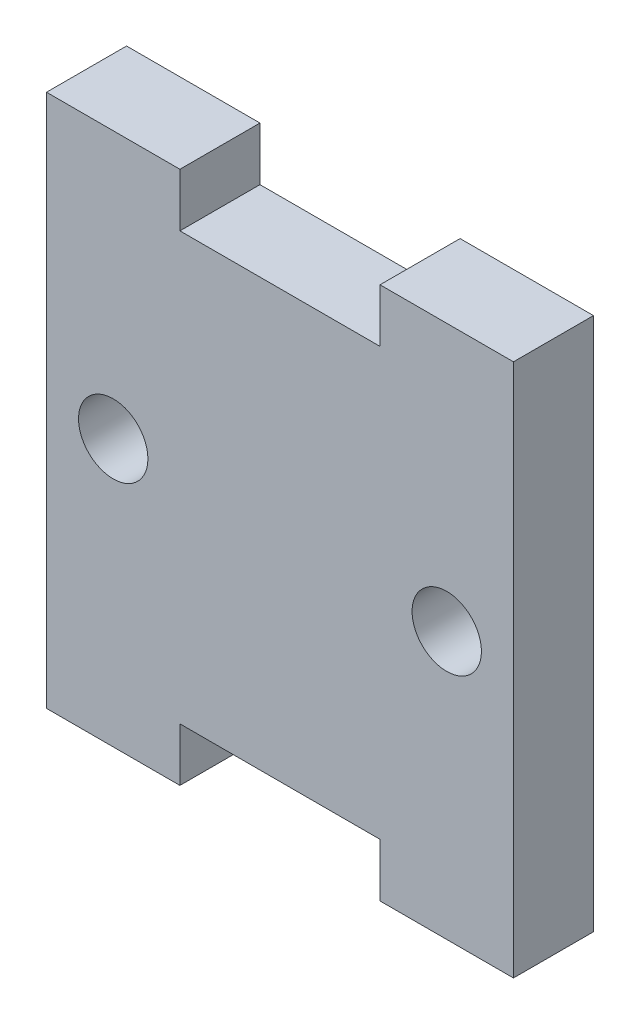
ISO-10303-21;
HEADER;
FILE_DESCRIPTION(('STEP AP214'),'2;1');
FILE_NAME('part.step','',(''),(''),'','','');
FILE_SCHEMA(('AUTOMOTIVE_DESIGN { 1 0 10303 214 1 1 1 1 }'));
ENDSEC;
DATA;
#1=APPLICATION_CONTEXT('core data for automotive mechanical design processes');
#2=APPLICATION_PROTOCOL_DEFINITION('international standard','automotive_design',2000,#1);
#3=PRODUCT_CONTEXT('',#1,'mechanical');
#4=PRODUCT('Part','Part','',(#3));
#5=PRODUCT_RELATED_PRODUCT_CATEGORY('part','',(#4));
#6=PRODUCT_DEFINITION_FORMATION('','',#4);
#7=PRODUCT_DEFINITION_CONTEXT('part definition',#1,'design');
#8=PRODUCT_DEFINITION('design','',#6,#7);
#9=PRODUCT_DEFINITION_SHAPE('','',#8);
#10=(LENGTH_UNIT() NAMED_UNIT(*) SI_UNIT(.MILLI.,.METRE.));
#11=(NAMED_UNIT(*) PLANE_ANGLE_UNIT() SI_UNIT($,.RADIAN.));
#12=(NAMED_UNIT(*) SI_UNIT($,.STERADIAN.) SOLID_ANGLE_UNIT());
#13=UNCERTAINTY_MEASURE_WITH_UNIT(LENGTH_MEASURE(1.E-05),#10,'distance_accuracy_value','');
#14=(GEOMETRIC_REPRESENTATION_CONTEXT(3) GLOBAL_UNCERTAINTY_ASSIGNED_CONTEXT((#13)) GLOBAL_UNIT_ASSIGNED_CONTEXT((#10,
#11,#12)) REPRESENTATION_CONTEXT('',''));
#15=CARTESIAN_POINT('',(0.,0.,0.));
#16=DIRECTION('',(0.,0.,1.));
#17=DIRECTION('',(1.,0.,0.));
#18=AXIS2_PLACEMENT_3D('',#15,#16,#17);
#19=CARTESIAN_POINT('',(-17.5,0.,6.));
#20=DIRECTION('',(-1.,0.,0.));
#21=DIRECTION('',(0.,0.,1.));
#22=AXIS2_PLACEMENT_3D('',#19,#20,#21);
#23=PLANE('',#22);
#24=DIRECTION('',(0.,1.,0.));
#25=VECTOR('',#24,1.);
#26=CARTESIAN_POINT('',(-17.5,0.,0.));
#27=LINE('',#26,#25);
#28=CARTESIAN_POINT('',(-17.5,-20.,0.));
#29=VERTEX_POINT('',#28);
#30=CARTESIAN_POINT('',(-17.5,20.,0.));
#31=VERTEX_POINT('',#30);
#32=EDGE_CURVE('E161',#29,#31,#27,.T.);
#33=ORIENTED_EDGE('',*,*,#32,.F.);
#34=DIRECTION('',(0.,0.,-1.));
#35=VECTOR('',#34,1.);
#36=CARTESIAN_POINT('',(-17.5,-20.,6.));
#37=LINE('',#36,#35);
#38=CARTESIAN_POINT('',(-17.5,-20.,6.));
#39=VERTEX_POINT('',#38);
#40=EDGE_CURVE('E11',#39,#29,#37,.T.);
#41=ORIENTED_EDGE('',*,*,#40,.F.);
#42=DIRECTION('',(0.,1.,0.));
#43=VECTOR('',#42,1.);
#44=CARTESIAN_POINT('',(-17.5,0.,6.));
#45=LINE('',#44,#43);
#46=CARTESIAN_POINT('',(-17.5,20.,6.));
#47=VERTEX_POINT('',#46);
#48=EDGE_CURVE('E197',#39,#47,#45,.T.);
#49=ORIENTED_EDGE('',*,*,#48,.T.);
#50=DIRECTION('',(0.,0.,-1.));
#51=VECTOR('',#50,1.);
#52=CARTESIAN_POINT('',(-17.5,20.,6.));
#53=LINE('',#52,#51);
#54=EDGE_CURVE('E99',#47,#31,#53,.T.);
#55=ORIENTED_EDGE('',*,*,#54,.T.);
#56=EDGE_LOOP('',(#33,#41,#49,#55));
#57=FACE_BOUND('',#56,.T.);
#58=ADVANCED_FACE('F37',(#57),#23,.T.);
#59=CARTESIAN_POINT('',(0.,-20.,6.));
#60=DIRECTION('',(0.,-1.,0.));
#61=DIRECTION('',(0.,0.,-1.));
#62=AXIS2_PLACEMENT_3D('',#59,#60,#61);
#63=PLANE('',#62);
#64=DIRECTION('',(-1.,0.,0.));
#65=VECTOR('',#64,1.);
#66=CARTESIAN_POINT('',(0.,-20.,0.));
#67=LINE('',#66,#65);
#68=CARTESIAN_POINT('',(-7.5,-20.,0.));
#69=VERTEX_POINT('',#68);
#70=EDGE_CURVE('E164',#69,#29,#67,.T.);
#71=ORIENTED_EDGE('',*,*,#70,.F.);
#72=DIRECTION('',(0.,0.,-1.));
#73=VECTOR('',#72,1.);
#74=CARTESIAN_POINT('',(-7.5,-20.,6.));
#75=LINE('',#74,#73);
#76=CARTESIAN_POINT('',(-7.5,-20.,6.));
#77=VERTEX_POINT('',#76);
#78=EDGE_CURVE('E45',#77,#69,#75,.T.);
#79=ORIENTED_EDGE('',*,*,#78,.F.);
#80=DIRECTION('',(-1.,0.,0.));
#81=VECTOR('',#80,1.);
#82=CARTESIAN_POINT('',(0.,-20.,6.));
#83=LINE('',#82,#81);
#84=EDGE_CURVE('E229',#77,#39,#83,.T.);
#85=ORIENTED_EDGE('',*,*,#84,.T.);
#86=ORIENTED_EDGE('',*,*,#40,.T.);
#87=EDGE_LOOP('',(#71,#79,#85,#86));
#88=FACE_BOUND('',#87,.T.);
#89=ADVANCED_FACE('F228',(#88),#63,.T.);
#90=CARTESIAN_POINT('',(-7.5,0.,6.));
#91=DIRECTION('',(-1.,0.,0.));
#92=DIRECTION('',(0.,0.,1.));
#93=AXIS2_PLACEMENT_3D('',#90,#91,#92);
#94=PLANE('',#93);
#95=DIRECTION('',(0.,1.,0.));
#96=VECTOR('',#95,1.);
#97=CARTESIAN_POINT('',(-7.5,0.,0.));
#98=LINE('',#97,#96);
#99=CARTESIAN_POINT('',(-7.5,-16.,0.));
#100=VERTEX_POINT('',#99);
#101=EDGE_CURVE('E167',#69,#100,#98,.T.);
#102=ORIENTED_EDGE('',*,*,#101,.T.);
#103=DIRECTION('',(0.,0.,-1.));
#104=VECTOR('',#103,1.);
#105=CARTESIAN_POINT('',(-7.5,-16.,6.));
#106=LINE('',#105,#104);
#107=CARTESIAN_POINT('',(-7.5,-16.,6.));
#108=VERTEX_POINT('',#107);
#109=EDGE_CURVE('E212',#108,#100,#106,.T.);
#110=ORIENTED_EDGE('',*,*,#109,.F.);
#111=DIRECTION('',(0.,1.,0.));
#112=VECTOR('',#111,1.);
#113=CARTESIAN_POINT('',(-7.5,0.,6.));
#114=LINE('',#113,#112);
#115=EDGE_CURVE('E219',#77,#108,#114,.T.);
#116=ORIENTED_EDGE('',*,*,#115,.F.);
#117=ORIENTED_EDGE('',*,*,#78,.T.);
#118=EDGE_LOOP('',(#102,#110,#116,#117));
#119=FACE_BOUND('',#118,.T.);
#120=ADVANCED_FACE('F217',(#119),#94,.F.);
#121=CARTESIAN_POINT('',(0.,-16.,6.));
#122=DIRECTION('',(0.,1.,0.));
#123=DIRECTION('',(0.,0.,1.));
#124=AXIS2_PLACEMENT_3D('',#121,#122,#123);
#125=PLANE('',#124);
#126=DIRECTION('',(1.,0.,0.));
#127=VECTOR('',#126,1.);
#128=CARTESIAN_POINT('',(0.,-16.,0.));
#129=LINE('',#128,#127);
#130=CARTESIAN_POINT('',(7.5,-16.,0.));
#131=VERTEX_POINT('',#130);
#132=EDGE_CURVE('E169',#100,#131,#129,.T.);
#133=ORIENTED_EDGE('',*,*,#132,.T.);
#134=DIRECTION('',(0.,0.,-1.));
#135=VECTOR('',#134,1.);
#136=CARTESIAN_POINT('',(7.5,-16.,6.));
#137=LINE('',#136,#135);
#138=CARTESIAN_POINT('',(7.5,-16.,6.));
#139=VERTEX_POINT('',#138);
#140=EDGE_CURVE('E210',#139,#131,#137,.T.);
#141=ORIENTED_EDGE('',*,*,#140,.F.);
#142=DIRECTION('',(1.,0.,0.));
#143=VECTOR('',#142,1.);
#144=CARTESIAN_POINT('',(0.,-16.,6.));
#145=LINE('',#144,#143);
#146=EDGE_CURVE('E235',#108,#139,#145,.T.);
#147=ORIENTED_EDGE('',*,*,#146,.F.);
#148=ORIENTED_EDGE('',*,*,#109,.T.);
#149=EDGE_LOOP('',(#133,#141,#147,#148));
#150=FACE_BOUND('',#149,.T.);
#151=ADVANCED_FACE('F276',(#150),#125,.F.);
#152=CARTESIAN_POINT('',(7.50000000000001,0.,6.));
#153=DIRECTION('',(-1.,0.,0.));
#154=DIRECTION('',(0.,-1.,0.));
#155=AXIS2_PLACEMENT_3D('',#152,#153,#154);
#156=PLANE('',#155);
#157=DIRECTION('',(0.,1.,0.));
#158=VECTOR('',#157,1.);
#159=CARTESIAN_POINT('',(7.50000000000001,0.,0.));
#160=LINE('',#159,#158);
#161=CARTESIAN_POINT('',(7.5,-20.,0.));
#162=VERTEX_POINT('',#161);
#163=EDGE_CURVE('E172',#162,#131,#160,.T.);
#164=ORIENTED_EDGE('',*,*,#163,.F.);
#165=DIRECTION('',(0.,0.,-1.));
#166=VECTOR('',#165,1.);
#167=CARTESIAN_POINT('',(7.5,-20.,6.));
#168=LINE('',#167,#166);
#169=CARTESIAN_POINT('',(7.5,-20.,6.));
#170=VERTEX_POINT('',#169);
#171=EDGE_CURVE('E208',#170,#162,#168,.T.);
#172=ORIENTED_EDGE('',*,*,#171,.F.);
#173=DIRECTION('',(0.,1.,0.));
#174=VECTOR('',#173,1.);
#175=CARTESIAN_POINT('',(7.50000000000001,0.,6.));
#176=LINE('',#175,#174);
#177=EDGE_CURVE('E237',#170,#139,#176,.T.);
#178=ORIENTED_EDGE('',*,*,#177,.T.);
#179=ORIENTED_EDGE('',*,*,#140,.T.);
#180=EDGE_LOOP('',(#164,#172,#178,#179));
#181=FACE_BOUND('',#180,.T.);
#182=ADVANCED_FACE('F281',(#181),#156,.T.);
#183=CARTESIAN_POINT('',(0.,-20.,6.));
#184=DIRECTION('',(0.,1.,0.));
#185=DIRECTION('',(0.,0.,1.));
#186=AXIS2_PLACEMENT_3D('',#183,#184,#185);
#187=PLANE('',#186);
#188=DIRECTION('',(1.,0.,0.));
#189=VECTOR('',#188,1.);
#190=CARTESIAN_POINT('',(0.,-20.,0.));
#191=LINE('',#190,#189);
#192=CARTESIAN_POINT('',(17.5,-20.,0.));
#193=VERTEX_POINT('',#192);
#194=EDGE_CURVE('E175',#162,#193,#191,.T.);
#195=ORIENTED_EDGE('',*,*,#194,.T.);
#196=DIRECTION('',(0.,0.,-1.));
#197=VECTOR('',#196,1.);
#198=CARTESIAN_POINT('',(17.5,-20.,6.));
#199=LINE('',#198,#197);
#200=CARTESIAN_POINT('',(17.5,-20.,6.));
#201=VERTEX_POINT('',#200);
#202=EDGE_CURVE('E205',#201,#193,#199,.T.);
#203=ORIENTED_EDGE('',*,*,#202,.F.);
#204=DIRECTION('',(1.,0.,0.));
#205=VECTOR('',#204,1.);
#206=CARTESIAN_POINT('',(0.,-20.,6.));
#207=LINE('',#206,#205);
#208=EDGE_CURVE('E240',#170,#201,#207,.T.);
#209=ORIENTED_EDGE('',*,*,#208,.F.);
#210=ORIENTED_EDGE('',*,*,#171,.T.);
#211=EDGE_LOOP('',(#195,#203,#209,#210));
#212=FACE_BOUND('',#211,.T.);
#213=ADVANCED_FACE('F285',(#212),#187,.F.);
#214=CARTESIAN_POINT('',(17.5,0.,6.));
#215=DIRECTION('',(-1.,0.,0.));
#216=DIRECTION('',(0.,0.,1.));
#217=AXIS2_PLACEMENT_3D('',#214,#215,#216);
#218=PLANE('',#217);
#219=DIRECTION('',(0.,1.,0.));
#220=VECTOR('',#219,1.);
#221=CARTESIAN_POINT('',(17.5,0.,0.));
#222=LINE('',#221,#220);
#223=CARTESIAN_POINT('',(17.5,20.,0.));
#224=VERTEX_POINT('',#223);
#225=EDGE_CURVE('E177',#193,#224,#222,.T.);
#226=ORIENTED_EDGE('',*,*,#225,.T.);
#227=DIRECTION('',(0.,0.,-1.));
#228=VECTOR('',#227,1.);
#229=CARTESIAN_POINT('',(17.5,20.,6.));
#230=LINE('',#229,#228);
#231=CARTESIAN_POINT('',(17.5,20.,6.));
#232=VERTEX_POINT('',#231);
#233=EDGE_CURVE('E203',#232,#224,#230,.T.);
#234=ORIENTED_EDGE('',*,*,#233,.F.);
#235=DIRECTION('',(0.,1.,0.));
#236=VECTOR('',#235,1.);
#237=CARTESIAN_POINT('',(17.5,0.,6.));
#238=LINE('',#237,#236);
#239=EDGE_CURVE('E242',#201,#232,#238,.T.);
#240=ORIENTED_EDGE('',*,*,#239,.F.);
#241=ORIENTED_EDGE('',*,*,#202,.T.);
#242=EDGE_LOOP('',(#226,#234,#240,#241));
#243=FACE_BOUND('',#242,.T.);
#244=ADVANCED_FACE('F255',(#243),#218,.F.);
#245=CARTESIAN_POINT('',(0.,20.,6.));
#246=DIRECTION('',(0.,1.,0.));
#247=DIRECTION('',(-1.,0.,0.));
#248=AXIS2_PLACEMENT_3D('',#245,#246,#247);
#249=PLANE('',#248);
#250=DIRECTION('',(1.,0.,0.));
#251=VECTOR('',#250,1.);
#252=CARTESIAN_POINT('',(0.,20.,0.));
#253=LINE('',#252,#251);
#254=CARTESIAN_POINT('',(7.49999999999999,20.,0.));
#255=VERTEX_POINT('',#254);
#256=EDGE_CURVE('E180',#255,#224,#253,.T.);
#257=ORIENTED_EDGE('',*,*,#256,.F.);
#258=DIRECTION('',(0.,0.,-1.));
#259=VECTOR('',#258,1.);
#260=CARTESIAN_POINT('',(7.49999999999999,20.,6.));
#261=LINE('',#260,#259);
#262=CARTESIAN_POINT('',(7.49999999999999,20.,6.));
#263=VERTEX_POINT('',#262);
#264=EDGE_CURVE('E201',#263,#255,#261,.T.);
#265=ORIENTED_EDGE('',*,*,#264,.F.);
#266=DIRECTION('',(1.,0.,0.));
#267=VECTOR('',#266,1.);
#268=CARTESIAN_POINT('',(0.,20.,6.));
#269=LINE('',#268,#267);
#270=EDGE_CURVE('E244',#263,#232,#269,.T.);
#271=ORIENTED_EDGE('',*,*,#270,.T.);
#272=ORIENTED_EDGE('',*,*,#233,.T.);
#273=EDGE_LOOP('',(#257,#265,#271,#272));
#274=FACE_BOUND('',#273,.T.);
#275=ADVANCED_FACE('F248',(#274),#249,.T.);
#276=CARTESIAN_POINT('',(7.50000000000001,0.,6.));
#277=DIRECTION('',(1.,0.,0.));
#278=DIRECTION('',(0.,1.,0.));
#279=AXIS2_PLACEMENT_3D('',#276,#277,#278);
#280=PLANE('',#279);
#281=DIRECTION('',(0.,-1.,0.));
#282=VECTOR('',#281,1.);
#283=CARTESIAN_POINT('',(7.50000000000001,0.,0.));
#284=LINE('',#283,#282);
#285=CARTESIAN_POINT('',(7.5,16.,0.));
#286=VERTEX_POINT('',#285);
#287=EDGE_CURVE('E183',#255,#286,#284,.T.);
#288=ORIENTED_EDGE('',*,*,#287,.T.);
#289=DIRECTION('',(0.,0.,-1.));
#290=VECTOR('',#289,1.);
#291=CARTESIAN_POINT('',(7.5,16.,6.));
#292=LINE('',#291,#290);
#293=CARTESIAN_POINT('',(7.5,16.,6.));
#294=VERTEX_POINT('',#293);
#295=EDGE_CURVE('E140',#294,#286,#292,.T.);
#296=ORIENTED_EDGE('',*,*,#295,.F.);
#297=DIRECTION('',(0.,-1.,0.));
#298=VECTOR('',#297,1.);
#299=CARTESIAN_POINT('',(7.50000000000001,0.,6.));
#300=LINE('',#299,#298);
#301=EDGE_CURVE('E147',#263,#294,#300,.T.);
#302=ORIENTED_EDGE('',*,*,#301,.F.);
#303=ORIENTED_EDGE('',*,*,#264,.T.);
#304=EDGE_LOOP('',(#288,#296,#302,#303));
#305=FACE_BOUND('',#304,.T.);
#306=ADVANCED_FACE('F260',(#305),#280,.F.);
#307=CARTESIAN_POINT('',(0.,16.,6.));
#308=DIRECTION('',(0.,1.,0.));
#309=DIRECTION('',(0.,0.,1.));
#310=AXIS2_PLACEMENT_3D('',#307,#308,#309);
#311=PLANE('',#310);
#312=DIRECTION('',(1.,0.,0.));
#313=VECTOR('',#312,1.);
#314=CARTESIAN_POINT('',(0.,16.,0.));
#315=LINE('',#314,#313);
#316=CARTESIAN_POINT('',(-7.5,16.,0.));
#317=VERTEX_POINT('',#316);
#318=EDGE_CURVE('E135',#317,#286,#315,.T.);
#319=ORIENTED_EDGE('',*,*,#318,.F.);
#320=DIRECTION('',(0.,0.,-1.));
#321=VECTOR('',#320,1.);
#322=CARTESIAN_POINT('',(-7.5,16.,6.));
#323=LINE('',#322,#321);
#324=CARTESIAN_POINT('',(-7.5,16.,6.));
#325=VERTEX_POINT('',#324);
#326=EDGE_CURVE('E130',#325,#317,#323,.T.);
#327=ORIENTED_EDGE('',*,*,#326,.F.);
#328=DIRECTION('',(1.,0.,0.));
#329=VECTOR('',#328,1.);
#330=CARTESIAN_POINT('',(0.,16.,6.));
#331=LINE('',#330,#329);
#332=EDGE_CURVE('E133',#325,#294,#331,.T.);
#333=ORIENTED_EDGE('',*,*,#332,.T.);
#334=ORIENTED_EDGE('',*,*,#295,.T.);
#335=EDGE_LOOP('',(#319,#327,#333,#334));
#336=FACE_BOUND('',#335,.T.);
#337=ADVANCED_FACE('F132',(#336),#311,.T.);
#338=CARTESIAN_POINT('',(-7.5,0.,6.));
#339=DIRECTION('',(1.,0.,0.));
#340=DIRECTION('',(0.,1.,0.));
#341=AXIS2_PLACEMENT_3D('',#338,#339,#340);
#342=PLANE('',#341);
#343=DIRECTION('',(0.,-1.,0.));
#344=VECTOR('',#343,1.);
#345=CARTESIAN_POINT('',(-7.5,0.,0.));
#346=LINE('',#345,#344);
#347=CARTESIAN_POINT('',(-7.50000000000001,20.,0.));
#348=VERTEX_POINT('',#347);
#349=EDGE_CURVE('E187',#348,#317,#346,.T.);
#350=ORIENTED_EDGE('',*,*,#349,.F.);
#351=DIRECTION('',(0.,0.,-1.));
#352=VECTOR('',#351,1.);
#353=CARTESIAN_POINT('',(-7.50000000000001,20.,6.));
#354=LINE('',#353,#352);
#355=CARTESIAN_POINT('',(-7.50000000000001,20.,6.));
#356=VERTEX_POINT('',#355);
#357=EDGE_CURVE('E92',#356,#348,#354,.T.);
#358=ORIENTED_EDGE('',*,*,#357,.F.);
#359=DIRECTION('',(0.,-1.,0.));
#360=VECTOR('',#359,1.);
#361=CARTESIAN_POINT('',(-7.5,0.,6.));
#362=LINE('',#361,#360);
#363=EDGE_CURVE('E144',#356,#325,#362,.T.);
#364=ORIENTED_EDGE('',*,*,#363,.T.);
#365=ORIENTED_EDGE('',*,*,#326,.T.);
#366=EDGE_LOOP('',(#350,#358,#364,#365));
#367=FACE_BOUND('',#366,.T.);
#368=ADVANCED_FACE('F150',(#367),#342,.T.);
#369=CARTESIAN_POINT('',(-12.5,0.,6.));
#370=DIRECTION('',(0.,0.,-1.));
#371=DIRECTION('',(-1.,0.,0.));
#372=AXIS2_PLACEMENT_3D('',#369,#370,#371);
#373=CYLINDRICAL_SURFACE('',#372,2.6);
#374=CARTESIAN_POINT('',(-12.5,0.,6.));
#375=DIRECTION('',(0.,0.,1.));
#376=DIRECTION('',(1.,0.,0.));
#377=AXIS2_PLACEMENT_3D('',#374,#375,#376);
#378=CIRCLE('',#377,2.6);
#379=CARTESIAN_POINT('',(-9.9,0.,6.));
#380=VERTEX_POINT('',#379);
#381=EDGE_CURVE('E152',#380,#380,#378,.T.);
#382=ORIENTED_EDGE('',*,*,#381,.T.);
#383=EDGE_LOOP('',(#382));
#384=FACE_BOUND('',#383,.T.);
#385=CARTESIAN_POINT('',(-12.5,0.,0.));
#386=DIRECTION('',(0.,0.,1.));
#387=DIRECTION('',(1.,0.,0.));
#388=AXIS2_PLACEMENT_3D('',#385,#386,#387);
#389=CIRCLE('',#388,2.6);
#390=CARTESIAN_POINT('',(-9.9,0.,0.));
#391=VERTEX_POINT('',#390);
#392=EDGE_CURVE('E191',#391,#391,#389,.T.);
#393=ORIENTED_EDGE('',*,*,#392,.F.);
#394=EDGE_LOOP('',(#393));
#395=FACE_BOUND('',#394,.T.);
#396=ADVANCED_FACE('F320',(#384,#395),#373,.F.);
#397=CARTESIAN_POINT('',(0.,20.,6.));
#398=DIRECTION('',(0.,-1.,0.));
#399=DIRECTION('',(1.,0.,0.));
#400=AXIS2_PLACEMENT_3D('',#397,#398,#399);
#401=PLANE('',#400);
#402=DIRECTION('',(-1.,0.,0.));
#403=VECTOR('',#402,1.);
#404=CARTESIAN_POINT('',(0.,20.,0.));
#405=LINE('',#404,#403);
#406=EDGE_CURVE('E189',#348,#31,#405,.T.);
#407=ORIENTED_EDGE('',*,*,#406,.T.);
#408=ORIENTED_EDGE('',*,*,#54,.F.);
#409=DIRECTION('',(-1.,0.,0.));
#410=VECTOR('',#409,1.);
#411=CARTESIAN_POINT('',(0.,20.,6.));
#412=LINE('',#411,#410);
#413=EDGE_CURVE('E53',#356,#47,#412,.T.);
#414=ORIENTED_EDGE('',*,*,#413,.F.);
#415=ORIENTED_EDGE('',*,*,#357,.T.);
#416=EDGE_LOOP('',(#407,#408,#414,#415));
#417=FACE_BOUND('',#416,.T.);
#418=ADVANCED_FACE('F230',(#417),#401,.F.);
#419=CARTESIAN_POINT('',(12.5,0.,6.));
#420=DIRECTION('',(0.,0.,-1.));
#421=DIRECTION('',(-1.,0.,0.));
#422=AXIS2_PLACEMENT_3D('',#419,#420,#421);
#423=CYLINDRICAL_SURFACE('',#422,2.6);
#424=CARTESIAN_POINT('',(12.5,0.,6.));
#425=DIRECTION('',(0.,0.,1.));
#426=DIRECTION('',(1.,0.,0.));
#427=AXIS2_PLACEMENT_3D('',#424,#425,#426);
#428=CIRCLE('',#427,2.6);
#429=CARTESIAN_POINT('',(15.1,0.,6.));
#430=VERTEX_POINT('',#429);
#431=EDGE_CURVE('E158',#430,#430,#428,.F.);
#432=ORIENTED_EDGE('',*,*,#431,.F.);
#433=EDGE_LOOP('',(#432));
#434=FACE_BOUND('',#433,.T.);
#435=CARTESIAN_POINT('',(12.5,0.,0.));
#436=DIRECTION('',(0.,0.,1.));
#437=DIRECTION('',(1.,0.,0.));
#438=AXIS2_PLACEMENT_3D('',#435,#436,#437);
#439=CIRCLE('',#438,2.6);
#440=CARTESIAN_POINT('',(15.1,0.,0.));
#441=VERTEX_POINT('',#440);
#442=EDGE_CURVE('E194',#441,#441,#439,.F.);
#443=ORIENTED_EDGE('',*,*,#442,.T.);
#444=EDGE_LOOP('',(#443));
#445=FACE_BOUND('',#444,.T.);
#446=ADVANCED_FACE('F338',(#434,#445),#423,.F.);
#447=CARTESIAN_POINT('',(0.,0.,6.));
#448=DIRECTION('',(0.,0.,1.));
#449=DIRECTION('',(1.,0.,0.));
#450=AXIS2_PLACEMENT_3D('',#447,#448,#449);
#451=PLANE('',#450);
#452=ORIENTED_EDGE('',*,*,#48,.F.);
#453=ORIENTED_EDGE('',*,*,#84,.F.);
#454=ORIENTED_EDGE('',*,*,#115,.T.);
#455=ORIENTED_EDGE('',*,*,#146,.T.);
#456=ORIENTED_EDGE('',*,*,#177,.F.);
#457=ORIENTED_EDGE('',*,*,#208,.T.);
#458=ORIENTED_EDGE('',*,*,#239,.T.);
#459=ORIENTED_EDGE('',*,*,#270,.F.);
#460=ORIENTED_EDGE('',*,*,#301,.T.);
#461=ORIENTED_EDGE('',*,*,#332,.F.);
#462=ORIENTED_EDGE('',*,*,#363,.F.);
#463=ORIENTED_EDGE('',*,*,#413,.T.);
#464=EDGE_LOOP('',(#452,#453,#454,#455,#456,#457,#458,#459,#460,#461,#462,#463));
#465=FACE_BOUND('',#464,.T.);
#466=ORIENTED_EDGE('',*,*,#381,.F.);
#467=EDGE_LOOP('',(#466));
#468=FACE_BOUND('',#467,.T.);
#469=ORIENTED_EDGE('',*,*,#431,.T.);
#470=EDGE_LOOP('',(#469));
#471=FACE_BOUND('',#470,.T.);
#472=ADVANCED_FACE('F142',(#465,#468,#471),#451,.T.);
#473=CARTESIAN_POINT('',(0.,0.,0.));
#474=DIRECTION('',(0.,0.,1.));
#475=DIRECTION('',(1.,0.,0.));
#476=AXIS2_PLACEMENT_3D('',#473,#474,#475);
#477=PLANE('',#476);
#478=ORIENTED_EDGE('',*,*,#32,.T.);
#479=ORIENTED_EDGE('',*,*,#406,.F.);
#480=ORIENTED_EDGE('',*,*,#349,.T.);
#481=ORIENTED_EDGE('',*,*,#318,.T.);
#482=ORIENTED_EDGE('',*,*,#287,.F.);
#483=ORIENTED_EDGE('',*,*,#256,.T.);
#484=ORIENTED_EDGE('',*,*,#225,.F.);
#485=ORIENTED_EDGE('',*,*,#194,.F.);
#486=ORIENTED_EDGE('',*,*,#163,.T.);
#487=ORIENTED_EDGE('',*,*,#132,.F.);
#488=ORIENTED_EDGE('',*,*,#101,.F.);
#489=ORIENTED_EDGE('',*,*,#70,.T.);
#490=EDGE_LOOP('',(#478,#479,#480,#481,#482,#483,#484,#485,#486,#487,#488,#489));
#491=FACE_BOUND('',#490,.T.);
#492=ORIENTED_EDGE('',*,*,#392,.T.);
#493=EDGE_LOOP('',(#492));
#494=FACE_BOUND('',#493,.T.);
#495=ORIENTED_EDGE('',*,*,#442,.F.);
#496=EDGE_LOOP('',(#495));
#497=FACE_BOUND('',#496,.T.);
#498=ADVANCED_FACE('F226',(#491,#494,#497),#477,.F.);
#499=CLOSED_SHELL('',(#58,#89,#120,#151,#182,#213,#244,#275,#306,#337,#368,#396,#418,#446,#472,#498));
#500=MANIFOLD_SOLID_BREP('B2',#499);
#501=ADVANCED_BREP_SHAPE_REPRESENTATION('',(#18,#500),#14);
#502=SHAPE_DEFINITION_REPRESENTATION(#9,#501);
ENDSEC;
END-ISO-10303-21;
